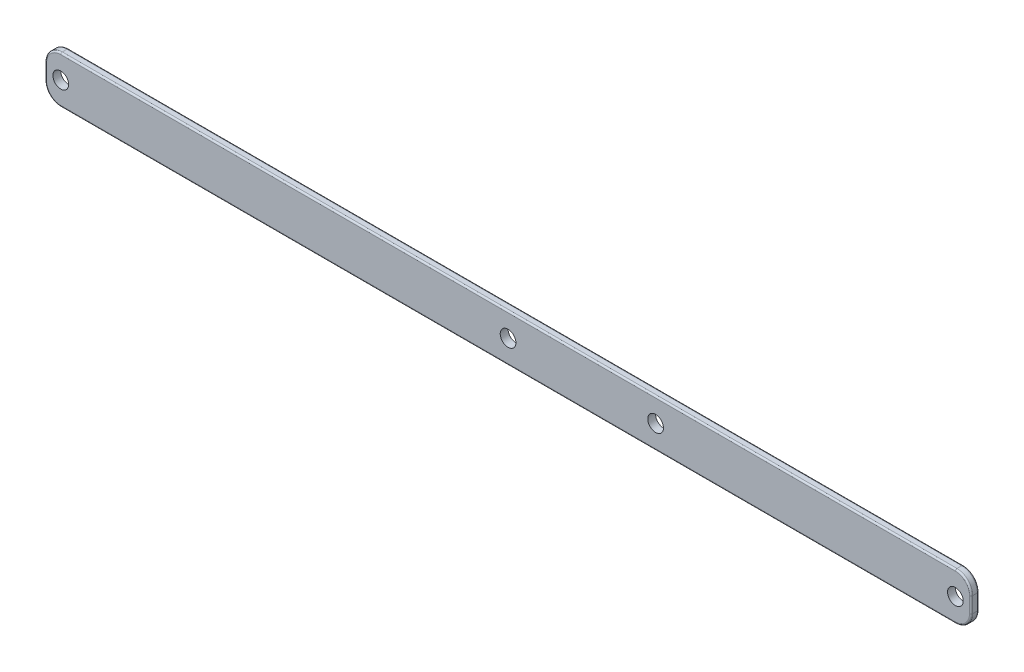
ISO-10303-21;
HEADER;
FILE_DESCRIPTION(('STEP AP214'),'2;1');
FILE_NAME('part.step','',(''),(''),'','','');
FILE_SCHEMA(('AUTOMOTIVE_DESIGN { 1 0 10303 214 1 1 1 1 }'));
ENDSEC;
DATA;
#1=APPLICATION_CONTEXT('core data for automotive mechanical design processes');
#2=APPLICATION_PROTOCOL_DEFINITION('international standard','automotive_design',2000,#1);
#3=PRODUCT_CONTEXT('',#1,'mechanical');
#4=PRODUCT('Part','Part','',(#3));
#5=PRODUCT_RELATED_PRODUCT_CATEGORY('part','',(#4));
#6=PRODUCT_DEFINITION_FORMATION('','',#4);
#7=PRODUCT_DEFINITION_CONTEXT('part definition',#1,'design');
#8=PRODUCT_DEFINITION('design','',#6,#7);
#9=PRODUCT_DEFINITION_SHAPE('','',#8);
#10=(LENGTH_UNIT() NAMED_UNIT(*) SI_UNIT(.MILLI.,.METRE.));
#11=(NAMED_UNIT(*) PLANE_ANGLE_UNIT() SI_UNIT($,.RADIAN.));
#12=(NAMED_UNIT(*) SI_UNIT($,.STERADIAN.) SOLID_ANGLE_UNIT());
#13=UNCERTAINTY_MEASURE_WITH_UNIT(LENGTH_MEASURE(1.E-05),#10,'distance_accuracy_value','');
#14=(GEOMETRIC_REPRESENTATION_CONTEXT(3) GLOBAL_UNCERTAINTY_ASSIGNED_CONTEXT((#13)) GLOBAL_UNIT_ASSIGNED_CONTEXT((#10,
#11,#12)) REPRESENTATION_CONTEXT('',''));
#15=CARTESIAN_POINT('',(0.,0.,0.));
#16=DIRECTION('',(0.,0.,1.));
#17=DIRECTION('',(1.,0.,0.));
#18=AXIS2_PLACEMENT_3D('',#15,#16,#17);
#19=CARTESIAN_POINT('',(0.,0.,5.));
#20=DIRECTION('',(0.,0.,1.));
#21=DIRECTION('',(1.,0.,0.));
#22=AXIS2_PLACEMENT_3D('',#19,#20,#21);
#23=PLANE('',#22);
#24=CARTESIAN_POINT('',(99.6776042775058,40.1673228346457,5.));
#25=DIRECTION('',(0.,0.,1.));
#26=DIRECTION('',(1.,0.,0.));
#27=AXIS2_PLACEMENT_3D('',#24,#25,#26);
#28=CIRCLE('',#27,5.00000000000001);
#29=CARTESIAN_POINT('',(104.677604277506,40.1673228346457,5.));
#30=VERTEX_POINT('',#29);
#31=EDGE_CURVE('E365',#30,#30,#28,.T.);
#32=ORIENTED_EDGE('',*,*,#31,.F.);
#33=EDGE_LOOP('',(#32));
#34=FACE_BOUND('',#33,.T.);
#35=DIRECTION('',(0.,-1.,0.));
#36=VECTOR('',#35,1.);
#37=CARTESIAN_POINT('',(-288.322395722494,35.1673228346457,5.));
#38=LINE('',#37,#36);
#39=CARTESIAN_POINT('',(-288.322395722494,45.1673228346457,5.));
#40=VERTEX_POINT('',#39);
#41=CARTESIAN_POINT('',(-288.322395722494,35.1673228346457,5.));
#42=VERTEX_POINT('',#41);
#43=EDGE_CURVE('E173',#40,#42,#38,.T.);
#44=ORIENTED_EDGE('',*,*,#43,.T.);
#45=CARTESIAN_POINT('',(-279.322395722494,35.1673228346457,5.));
#46=DIRECTION('',(0.,0.,1.));
#47=DIRECTION('',(1.,0.,0.));
#48=AXIS2_PLACEMENT_3D('',#45,#46,#47);
#49=CIRCLE('',#48,9.);
#50=CARTESIAN_POINT('',(-279.322395722494,26.1673228346457,5.));
#51=VERTEX_POINT('',#50);
#52=EDGE_CURVE('E154',#42,#51,#49,.T.);
#53=ORIENTED_EDGE('',*,*,#52,.T.);
#54=DIRECTION('',(1.,0.,0.));
#55=VECTOR('',#54,1.);
#56=CARTESIAN_POINT('',(290.677604277506,26.1673228346457,5.));
#57=LINE('',#56,#55);
#58=CARTESIAN_POINT('',(290.677604277506,26.1673228346457,5.));
#59=VERTEX_POINT('',#58);
#60=EDGE_CURVE('E162',#51,#59,#57,.T.);
#61=ORIENTED_EDGE('',*,*,#60,.T.);
#62=CARTESIAN_POINT('',(290.677604277506,35.1673228346457,5.));
#63=DIRECTION('',(0.,0.,1.));
#64=DIRECTION('',(1.,0.,0.));
#65=AXIS2_PLACEMENT_3D('',#62,#63,#64);
#66=CIRCLE('',#65,9.);
#67=CARTESIAN_POINT('',(299.677604277506,35.1673228346457,5.));
#68=VERTEX_POINT('',#67);
#69=EDGE_CURVE('E168',#59,#68,#66,.T.);
#70=ORIENTED_EDGE('',*,*,#69,.T.);
#71=DIRECTION('',(0.,1.,0.));
#72=VECTOR('',#71,1.);
#73=CARTESIAN_POINT('',(299.677604277506,45.1673228346457,5.));
#74=LINE('',#73,#72);
#75=CARTESIAN_POINT('',(299.677604277506,45.1673228346457,5.));
#76=VERTEX_POINT('',#75);
#77=EDGE_CURVE('E299',#68,#76,#74,.T.);
#78=ORIENTED_EDGE('',*,*,#77,.T.);
#79=CARTESIAN_POINT('',(290.677604277506,45.1673228346457,5.));
#80=DIRECTION('',(0.,0.,1.));
#81=DIRECTION('',(1.,0.,0.));
#82=AXIS2_PLACEMENT_3D('',#79,#80,#81);
#83=CIRCLE('',#82,9.);
#84=CARTESIAN_POINT('',(290.677604277506,54.1673228346457,5.));
#85=VERTEX_POINT('',#84);
#86=EDGE_CURVE('E301',#76,#85,#83,.T.);
#87=ORIENTED_EDGE('',*,*,#86,.T.);
#88=DIRECTION('',(-1.,0.,0.));
#89=VECTOR('',#88,1.);
#90=CARTESIAN_POINT('',(-279.322395722494,54.1673228346457,5.));
#91=LINE('',#90,#89);
#92=CARTESIAN_POINT('',(-279.322395722494,54.1673228346457,5.));
#93=VERTEX_POINT('',#92);
#94=EDGE_CURVE('E303',#85,#93,#91,.T.);
#95=ORIENTED_EDGE('',*,*,#94,.T.);
#96=CARTESIAN_POINT('',(-279.322395722494,45.1673228346457,5.));
#97=DIRECTION('',(0.,0.,1.));
#98=DIRECTION('',(1.,0.,0.));
#99=AXIS2_PLACEMENT_3D('',#96,#97,#98);
#100=CIRCLE('',#99,9.);
#101=EDGE_CURVE('E179',#93,#40,#100,.T.);
#102=ORIENTED_EDGE('',*,*,#101,.T.);
#103=EDGE_LOOP('',(#44,#53,#61,#70,#78,#87,#95,#102));
#104=FACE_BOUND('',#103,.T.);
#105=CARTESIAN_POINT('',(290.677604277506,40.1673228346457,5.));
#106=DIRECTION('',(0.,0.,1.));
#107=DIRECTION('',(1.,0.,0.));
#108=AXIS2_PLACEMENT_3D('',#105,#106,#107);
#109=CIRCLE('',#108,4.99999999999999);
#110=CARTESIAN_POINT('',(295.677604277506,40.1673228346457,5.));
#111=VERTEX_POINT('',#110);
#112=EDGE_CURVE('E350',#111,#111,#109,.T.);
#113=ORIENTED_EDGE('',*,*,#112,.F.);
#114=EDGE_LOOP('',(#113));
#115=FACE_BOUND('',#114,.T.);
#116=CARTESIAN_POINT('',(-279.322395722494,40.1673228346457,5.));
#117=DIRECTION('',(0.,0.,1.));
#118=DIRECTION('',(1.,0.,0.));
#119=AXIS2_PLACEMENT_3D('',#116,#117,#118);
#120=CIRCLE('',#119,4.99999999999999);
#121=CARTESIAN_POINT('',(-274.322395722494,40.1673228346457,5.));
#122=VERTEX_POINT('',#121);
#123=EDGE_CURVE('E346',#122,#122,#120,.T.);
#124=ORIENTED_EDGE('',*,*,#123,.F.);
#125=EDGE_LOOP('',(#124));
#126=FACE_BOUND('',#125,.T.);
#127=CARTESIAN_POINT('',(5.67760427750585,40.1673228346457,5.));
#128=DIRECTION('',(0.,0.,1.));
#129=DIRECTION('',(1.,0.,0.));
#130=AXIS2_PLACEMENT_3D('',#127,#128,#129);
#131=CIRCLE('',#130,5.);
#132=CARTESIAN_POINT('',(10.6776042775059,40.1673228346457,5.));
#133=VERTEX_POINT('',#132);
#134=EDGE_CURVE('E356',#133,#133,#131,.T.);
#135=ORIENTED_EDGE('',*,*,#134,.F.);
#136=EDGE_LOOP('',(#135));
#137=FACE_BOUND('',#136,.T.);
#138=ADVANCED_FACE('F33',(#34,#104,#115,#126,#137),#23,.T.);
#139=CARTESIAN_POINT('',(0.,0.,0.));
#140=DIRECTION('',(0.,0.,1.));
#141=DIRECTION('',(1.,0.,0.));
#142=AXIS2_PLACEMENT_3D('',#139,#140,#141);
#143=PLANE('',#142);
#144=CARTESIAN_POINT('',(99.6776042775058,40.1673228346457,0.));
#145=DIRECTION('',(0.,0.,1.));
#146=DIRECTION('',(1.,0.,0.));
#147=AXIS2_PLACEMENT_3D('',#144,#145,#146);
#148=CIRCLE('',#147,5.00000000000001);
#149=CARTESIAN_POINT('',(104.677604277506,40.1673228346457,0.));
#150=VERTEX_POINT('',#149);
#151=EDGE_CURVE('E244',#150,#150,#148,.F.);
#152=ORIENTED_EDGE('',*,*,#151,.F.);
#153=EDGE_LOOP('',(#152));
#154=FACE_BOUND('',#153,.T.);
#155=DIRECTION('',(1.,0.,0.));
#156=VECTOR('',#155,1.);
#157=CARTESIAN_POINT('',(0.,26.1673228346457,0.));
#158=LINE('',#157,#156);
#159=CARTESIAN_POINT('',(290.677604277506,26.1673228346457,0.));
#160=VERTEX_POINT('',#159);
#161=CARTESIAN_POINT('',(-279.322395722494,26.1673228346457,0.));
#162=VERTEX_POINT('',#161);
#163=EDGE_CURVE('E208',#160,#162,#158,.F.);
#164=ORIENTED_EDGE('',*,*,#163,.T.);
#165=CARTESIAN_POINT('',(-279.322395722494,35.1673228346457,0.));
#166=DIRECTION('',(0.,0.,1.));
#167=DIRECTION('',(1.,0.,0.));
#168=AXIS2_PLACEMENT_3D('',#165,#166,#167);
#169=CIRCLE('',#168,9.);
#170=CARTESIAN_POINT('',(-288.322395722494,35.1673228346457,0.));
#171=VERTEX_POINT('',#170);
#172=EDGE_CURVE('E221',#162,#171,#169,.F.);
#173=ORIENTED_EDGE('',*,*,#172,.T.);
#174=DIRECTION('',(0.,-1.,0.));
#175=VECTOR('',#174,1.);
#176=CARTESIAN_POINT('',(-288.322395722494,5.33503603743665E-13,0.));
#177=LINE('',#176,#175);
#178=CARTESIAN_POINT('',(-288.322395722494,45.1673228346457,0.));
#179=VERTEX_POINT('',#178);
#180=EDGE_CURVE('E57',#171,#179,#177,.F.);
#181=ORIENTED_EDGE('',*,*,#180,.T.);
#182=CARTESIAN_POINT('',(-279.322395722494,45.1673228346457,0.));
#183=DIRECTION('',(0.,0.,1.));
#184=DIRECTION('',(1.,0.,0.));
#185=AXIS2_PLACEMENT_3D('',#182,#183,#184);
#186=CIRCLE('',#185,9.);
#187=CARTESIAN_POINT('',(-279.322395722494,54.1673228346457,0.));
#188=VERTEX_POINT('',#187);
#189=EDGE_CURVE('E218',#179,#188,#186,.F.);
#190=ORIENTED_EDGE('',*,*,#189,.T.);
#191=DIRECTION('',(-1.,0.,0.));
#192=VECTOR('',#191,1.);
#193=CARTESIAN_POINT('',(0.,54.1673228346457,0.));
#194=LINE('',#193,#192);
#195=CARTESIAN_POINT('',(290.677604277506,54.1673228346457,0.));
#196=VERTEX_POINT('',#195);
#197=EDGE_CURVE('E216',#188,#196,#194,.F.);
#198=ORIENTED_EDGE('',*,*,#197,.T.);
#199=CARTESIAN_POINT('',(290.677604277506,45.1673228346457,0.));
#200=DIRECTION('',(0.,0.,1.));
#201=DIRECTION('',(1.,0.,0.));
#202=AXIS2_PLACEMENT_3D('',#199,#200,#201);
#203=CIRCLE('',#202,9.);
#204=CARTESIAN_POINT('',(299.677604277506,45.1673228346457,0.));
#205=VERTEX_POINT('',#204);
#206=EDGE_CURVE('E214',#196,#205,#203,.F.);
#207=ORIENTED_EDGE('',*,*,#206,.T.);
#208=DIRECTION('',(0.,1.,0.));
#209=VECTOR('',#208,1.);
#210=CARTESIAN_POINT('',(299.677604277506,0.,0.));
#211=LINE('',#210,#209);
#212=CARTESIAN_POINT('',(299.677604277506,35.1673228346457,0.));
#213=VERTEX_POINT('',#212);
#214=EDGE_CURVE('E212',#205,#213,#211,.F.);
#215=ORIENTED_EDGE('',*,*,#214,.T.);
#216=CARTESIAN_POINT('',(290.677604277506,35.1673228346457,0.));
#217=DIRECTION('',(0.,0.,1.));
#218=DIRECTION('',(1.,0.,0.));
#219=AXIS2_PLACEMENT_3D('',#216,#217,#218);
#220=CIRCLE('',#219,9.);
#221=EDGE_CURVE('E210',#213,#160,#220,.F.);
#222=ORIENTED_EDGE('',*,*,#221,.T.);
#223=EDGE_LOOP('',(#164,#173,#181,#190,#198,#207,#215,#222));
#224=FACE_BOUND('',#223,.T.);
#225=CARTESIAN_POINT('',(-279.322395722494,40.1673228346457,0.));
#226=DIRECTION('',(0.,0.,1.));
#227=DIRECTION('',(1.,0.,0.));
#228=AXIS2_PLACEMENT_3D('',#225,#226,#227);
#229=CIRCLE('',#228,4.99999999999999);
#230=CARTESIAN_POINT('',(-274.322395722494,40.1673228346457,0.));
#231=VERTEX_POINT('',#230);
#232=EDGE_CURVE('E347',#231,#231,#229,.T.);
#233=ORIENTED_EDGE('',*,*,#232,.T.);
#234=EDGE_LOOP('',(#233));
#235=FACE_BOUND('',#234,.T.);
#236=CARTESIAN_POINT('',(290.677604277506,40.1673228346457,0.));
#237=DIRECTION('',(0.,0.,1.));
#238=DIRECTION('',(1.,0.,0.));
#239=AXIS2_PLACEMENT_3D('',#236,#237,#238);
#240=CIRCLE('',#239,4.99999999999999);
#241=CARTESIAN_POINT('',(295.677604277506,40.1673228346457,0.));
#242=VERTEX_POINT('',#241);
#243=EDGE_CURVE('E353',#242,#242,#240,.T.);
#244=ORIENTED_EDGE('',*,*,#243,.T.);
#245=EDGE_LOOP('',(#244));
#246=FACE_BOUND('',#245,.T.);
#247=CARTESIAN_POINT('',(5.67760427750585,40.1673228346457,0.));
#248=DIRECTION('',(0.,0.,1.));
#249=DIRECTION('',(1.,0.,0.));
#250=AXIS2_PLACEMENT_3D('',#247,#248,#249);
#251=CIRCLE('',#250,5.);
#252=CARTESIAN_POINT('',(10.6776042775059,40.1673228346457,0.));
#253=VERTEX_POINT('',#252);
#254=EDGE_CURVE('E241',#253,#253,#251,.T.);
#255=ORIENTED_EDGE('',*,*,#254,.T.);
#256=EDGE_LOOP('',(#255));
#257=FACE_BOUND('',#256,.T.);
#258=ADVANCED_FACE('F327',(#154,#224,#235,#246,#257),#143,.F.);
#259=CARTESIAN_POINT('',(-289.322395722494,55.1673228346457,5.));
#260=DIRECTION('',(1.,0.,0.));
#261=DIRECTION('',(0.,1.,0.));
#262=AXIS2_PLACEMENT_3D('',#259,#260,#261);
#263=PLANE('',#262);
#264=DIRECTION('',(0.,0.,-1.));
#265=VECTOR('',#264,1.);
#266=CARTESIAN_POINT('',(-289.322395722494,35.1673228346457,5.));
#267=LINE('',#266,#265);
#268=CARTESIAN_POINT('',(-289.322395722494,35.1673228346457,1.));
#269=VERTEX_POINT('',#268);
#270=CARTESIAN_POINT('',(-289.322395722494,35.1673228346457,4.));
#271=VERTEX_POINT('',#270);
#272=EDGE_CURVE('E169',#269,#271,#267,.F.);
#273=ORIENTED_EDGE('',*,*,#272,.T.);
#274=DIRECTION('',(0.,-1.,0.));
#275=VECTOR('',#274,1.);
#276=CARTESIAN_POINT('',(-289.322395722494,45.1673228346457,4.));
#277=LINE('',#276,#275);
#278=CARTESIAN_POINT('',(-289.322395722494,45.1673228346457,4.));
#279=VERTEX_POINT('',#278);
#280=EDGE_CURVE('E186',#271,#279,#277,.F.);
#281=ORIENTED_EDGE('',*,*,#280,.T.);
#282=DIRECTION('',(0.,0.,-1.));
#283=VECTOR('',#282,1.);
#284=CARTESIAN_POINT('',(-289.322395722494,45.1673228346457,5.));
#285=LINE('',#284,#283);
#286=CARTESIAN_POINT('',(-289.322395722494,45.1673228346457,1.));
#287=VERTEX_POINT('',#286);
#288=EDGE_CURVE('E287',#279,#287,#285,.T.);
#289=ORIENTED_EDGE('',*,*,#288,.T.);
#290=DIRECTION('',(0.,-1.,0.));
#291=VECTOR('',#290,1.);
#292=CARTESIAN_POINT('',(-289.322395722494,55.1673228346457,1.));
#293=LINE('',#292,#291);
#294=EDGE_CURVE('E184',#287,#269,#293,.T.);
#295=ORIENTED_EDGE('',*,*,#294,.T.);
#296=EDGE_LOOP('',(#273,#281,#289,#295));
#297=FACE_BOUND('',#296,.T.);
#298=ADVANCED_FACE('F322',(#297),#263,.F.);
#299=CARTESIAN_POINT('',(-289.322395722494,25.1673228346457,5.));
#300=DIRECTION('',(0.,1.,0.));
#301=DIRECTION('',(0.,0.,1.));
#302=AXIS2_PLACEMENT_3D('',#299,#300,#301);
#303=PLANE('',#302);
#304=DIRECTION('',(0.,0.,-1.));
#305=VECTOR('',#304,1.);
#306=CARTESIAN_POINT('',(290.677604277506,25.1673228346457,5.));
#307=LINE('',#306,#305);
#308=CARTESIAN_POINT('',(290.677604277506,25.1673228346457,1.));
#309=VERTEX_POINT('',#308);
#310=CARTESIAN_POINT('',(290.677604277506,25.1673228346457,4.));
#311=VERTEX_POINT('',#310);
#312=EDGE_CURVE('E292',#309,#311,#307,.F.);
#313=ORIENTED_EDGE('',*,*,#312,.T.);
#314=DIRECTION('',(1.,0.,0.));
#315=VECTOR('',#314,1.);
#316=CARTESIAN_POINT('',(-279.322395722494,25.1673228346457,4.));
#317=LINE('',#316,#315);
#318=CARTESIAN_POINT('',(-279.322395722494,25.1673228346457,4.));
#319=VERTEX_POINT('',#318);
#320=EDGE_CURVE('E11',#311,#319,#317,.F.);
#321=ORIENTED_EDGE('',*,*,#320,.T.);
#322=DIRECTION('',(0.,0.,-1.));
#323=VECTOR('',#322,1.);
#324=CARTESIAN_POINT('',(-279.322395722494,25.1673228346457,5.));
#325=LINE('',#324,#323);
#326=CARTESIAN_POINT('',(-279.322395722494,25.1673228346457,1.));
#327=VERTEX_POINT('',#326);
#328=EDGE_CURVE('E321',#319,#327,#325,.T.);
#329=ORIENTED_EDGE('',*,*,#328,.T.);
#330=DIRECTION('',(1.,0.,0.));
#331=VECTOR('',#330,1.);
#332=CARTESIAN_POINT('',(-289.322395722494,25.1673228346457,1.));
#333=LINE('',#332,#331);
#334=EDGE_CURVE('E42',#327,#309,#333,.T.);
#335=ORIENTED_EDGE('',*,*,#334,.T.);
#336=EDGE_LOOP('',(#313,#321,#329,#335));
#337=FACE_BOUND('',#336,.T.);
#338=ADVANCED_FACE('F339',(#337),#303,.F.);
#339=CARTESIAN_POINT('',(300.677604277506,55.1673228346457,5.));
#340=DIRECTION('',(-1.,0.,0.));
#341=DIRECTION('',(0.,0.,1.));
#342=AXIS2_PLACEMENT_3D('',#339,#340,#341);
#343=PLANE('',#342);
#344=DIRECTION('',(0.,0.,-1.));
#345=VECTOR('',#344,1.);
#346=CARTESIAN_POINT('',(300.677604277506,45.1673228346457,5.));
#347=LINE('',#346,#345);
#348=CARTESIAN_POINT('',(300.677604277506,45.1673228346457,1.));
#349=VERTEX_POINT('',#348);
#350=CARTESIAN_POINT('',(300.677604277506,45.1673228346457,4.));
#351=VERTEX_POINT('',#350);
#352=EDGE_CURVE('E281',#349,#351,#347,.F.);
#353=ORIENTED_EDGE('',*,*,#352,.T.);
#354=DIRECTION('',(0.,1.,0.));
#355=VECTOR('',#354,1.);
#356=CARTESIAN_POINT('',(300.677604277506,35.1673228346457,4.));
#357=LINE('',#356,#355);
#358=CARTESIAN_POINT('',(300.677604277506,35.1673228346457,4.));
#359=VERTEX_POINT('',#358);
#360=EDGE_CURVE('E202',#351,#359,#357,.F.);
#361=ORIENTED_EDGE('',*,*,#360,.T.);
#362=DIRECTION('',(0.,0.,-1.));
#363=VECTOR('',#362,1.);
#364=CARTESIAN_POINT('',(300.677604277506,35.1673228346457,5.));
#365=LINE('',#364,#363);
#366=CARTESIAN_POINT('',(300.677604277506,35.1673228346457,1.));
#367=VERTEX_POINT('',#366);
#368=EDGE_CURVE('E340',#359,#367,#365,.T.);
#369=ORIENTED_EDGE('',*,*,#368,.T.);
#370=DIRECTION('',(0.,1.,0.));
#371=VECTOR('',#370,1.);
#372=CARTESIAN_POINT('',(300.677604277506,55.1673228346457,1.));
#373=LINE('',#372,#371);
#374=EDGE_CURVE('E200',#367,#349,#373,.T.);
#375=ORIENTED_EDGE('',*,*,#374,.T.);
#376=EDGE_LOOP('',(#353,#361,#369,#375));
#377=FACE_BOUND('',#376,.T.);
#378=ADVANCED_FACE('F385',(#377),#343,.F.);
#379=CARTESIAN_POINT('',(-289.322395722494,55.1673228346457,5.));
#380=DIRECTION('',(0.,-1.,0.));
#381=DIRECTION('',(0.,0.,-1.));
#382=AXIS2_PLACEMENT_3D('',#379,#380,#381);
#383=PLANE('',#382);
#384=DIRECTION('',(0.,0.,-1.));
#385=VECTOR('',#384,1.);
#386=CARTESIAN_POINT('',(-279.322395722494,55.1673228346457,5.));
#387=LINE('',#386,#385);
#388=CARTESIAN_POINT('',(-279.322395722494,55.1673228346457,1.));
#389=VERTEX_POINT('',#388);
#390=CARTESIAN_POINT('',(-279.322395722494,55.1673228346457,4.));
#391=VERTEX_POINT('',#390);
#392=EDGE_CURVE('E288',#389,#391,#387,.F.);
#393=ORIENTED_EDGE('',*,*,#392,.T.);
#394=DIRECTION('',(-1.,0.,0.));
#395=VECTOR('',#394,1.);
#396=CARTESIAN_POINT('',(290.677604277506,55.1673228346457,4.));
#397=LINE('',#396,#395);
#398=CARTESIAN_POINT('',(290.677604277506,55.1673228346457,4.));
#399=VERTEX_POINT('',#398);
#400=EDGE_CURVE('E194',#391,#399,#397,.F.);
#401=ORIENTED_EDGE('',*,*,#400,.T.);
#402=DIRECTION('',(0.,0.,-1.));
#403=VECTOR('',#402,1.);
#404=CARTESIAN_POINT('',(290.677604277506,55.1673228346457,5.));
#405=LINE('',#404,#403);
#406=CARTESIAN_POINT('',(290.677604277506,55.1673228346457,1.));
#407=VERTEX_POINT('',#406);
#408=EDGE_CURVE('E278',#399,#407,#405,.T.);
#409=ORIENTED_EDGE('',*,*,#408,.T.);
#410=DIRECTION('',(-1.,0.,0.));
#411=VECTOR('',#410,1.);
#412=CARTESIAN_POINT('',(-289.322395722494,55.1673228346457,1.));
#413=LINE('',#412,#411);
#414=EDGE_CURVE('E192',#407,#389,#413,.T.);
#415=ORIENTED_EDGE('',*,*,#414,.T.);
#416=EDGE_LOOP('',(#393,#401,#409,#415));
#417=FACE_BOUND('',#416,.T.);
#418=ADVANCED_FACE('F284',(#417),#383,.F.);
#419=CARTESIAN_POINT('',(-279.322395722494,40.1673228346457,5.));
#420=DIRECTION('',(0.,0.,-1.));
#421=DIRECTION('',(-1.,0.,0.));
#422=AXIS2_PLACEMENT_3D('',#419,#420,#421);
#423=CYLINDRICAL_SURFACE('',#422,4.99999999999999);
#424=ORIENTED_EDGE('',*,*,#123,.T.);
#425=EDGE_LOOP('',(#424));
#426=FACE_BOUND('',#425,.T.);
#427=ORIENTED_EDGE('',*,*,#232,.F.);
#428=EDGE_LOOP('',(#427));
#429=FACE_BOUND('',#428,.T.);
#430=ADVANCED_FACE('F380',(#426,#429),#423,.F.);
#431=CARTESIAN_POINT('',(290.677604277506,40.1673228346457,5.));
#432=DIRECTION('',(0.,0.,-1.));
#433=DIRECTION('',(-1.,0.,0.));
#434=AXIS2_PLACEMENT_3D('',#431,#432,#433);
#435=CYLINDRICAL_SURFACE('',#434,4.99999999999999);
#436=ORIENTED_EDGE('',*,*,#112,.T.);
#437=EDGE_LOOP('',(#436));
#438=FACE_BOUND('',#437,.T.);
#439=ORIENTED_EDGE('',*,*,#243,.F.);
#440=EDGE_LOOP('',(#439));
#441=FACE_BOUND('',#440,.T.);
#442=ADVANCED_FACE('F507',(#438,#441),#435,.F.);
#443=CARTESIAN_POINT('',(5.67760427750585,40.1673228346457,5.));
#444=DIRECTION('',(0.,0.,-1.));
#445=DIRECTION('',(-1.,0.,0.));
#446=AXIS2_PLACEMENT_3D('',#443,#444,#445);
#447=CYLINDRICAL_SURFACE('',#446,5.);
#448=ORIENTED_EDGE('',*,*,#134,.T.);
#449=EDGE_LOOP('',(#448));
#450=FACE_BOUND('',#449,.T.);
#451=ORIENTED_EDGE('',*,*,#254,.F.);
#452=EDGE_LOOP('',(#451));
#453=FACE_BOUND('',#452,.T.);
#454=ADVANCED_FACE('F396',(#450,#453),#447,.F.);
#455=CARTESIAN_POINT('',(290.677604277506,35.1673228346457,5.));
#456=DIRECTION('',(0.,0.,-1.));
#457=DIRECTION('',(-1.,0.,0.));
#458=AXIS2_PLACEMENT_3D('',#455,#456,#457);
#459=CYLINDRICAL_SURFACE('',#458,10.);
#460=ORIENTED_EDGE('',*,*,#368,.F.);
#461=CARTESIAN_POINT('',(290.677604277506,35.1673228346457,4.));
#462=DIRECTION('',(0.,0.,1.));
#463=DIRECTION('',(1.,0.,0.));
#464=AXIS2_PLACEMENT_3D('',#461,#462,#463);
#465=CIRCLE('',#464,10.);
#466=EDGE_CURVE('E206',#359,#311,#465,.F.);
#467=ORIENTED_EDGE('',*,*,#466,.T.);
#468=ORIENTED_EDGE('',*,*,#312,.F.);
#469=CARTESIAN_POINT('',(290.677604277506,35.1673228346457,1.));
#470=DIRECTION('',(0.,0.,1.));
#471=DIRECTION('',(1.,0.,0.));
#472=AXIS2_PLACEMENT_3D('',#469,#470,#471);
#473=CIRCLE('',#472,10.);
#474=EDGE_CURVE('E204',#309,#367,#473,.T.);
#475=ORIENTED_EDGE('',*,*,#474,.T.);
#476=EDGE_LOOP('',(#460,#467,#468,#475));
#477=FACE_BOUND('',#476,.T.);
#478=ADVANCED_FACE('F393',(#477),#459,.T.);
#479=CARTESIAN_POINT('',(290.677604277506,45.1673228346457,5.));
#480=DIRECTION('',(0.,0.,-1.));
#481=DIRECTION('',(-1.,0.,0.));
#482=AXIS2_PLACEMENT_3D('',#479,#480,#481);
#483=CYLINDRICAL_SURFACE('',#482,10.);
#484=ORIENTED_EDGE('',*,*,#408,.F.);
#485=CARTESIAN_POINT('',(290.677604277506,45.1673228346457,4.));
#486=DIRECTION('',(0.,0.,1.));
#487=DIRECTION('',(1.,0.,0.));
#488=AXIS2_PLACEMENT_3D('',#485,#486,#487);
#489=CIRCLE('',#488,10.);
#490=EDGE_CURVE('E198',#399,#351,#489,.F.);
#491=ORIENTED_EDGE('',*,*,#490,.T.);
#492=ORIENTED_EDGE('',*,*,#352,.F.);
#493=CARTESIAN_POINT('',(290.677604277506,45.1673228346457,1.));
#494=DIRECTION('',(0.,0.,1.));
#495=DIRECTION('',(1.,0.,0.));
#496=AXIS2_PLACEMENT_3D('',#493,#494,#495);
#497=CIRCLE('',#496,10.);
#498=EDGE_CURVE('E196',#349,#407,#497,.T.);
#499=ORIENTED_EDGE('',*,*,#498,.T.);
#500=EDGE_LOOP('',(#484,#491,#492,#499));
#501=FACE_BOUND('',#500,.T.);
#502=ADVANCED_FACE('F277',(#501),#483,.T.);
#503=CARTESIAN_POINT('',(-279.322395722494,35.1673228346457,5.));
#504=DIRECTION('',(0.,0.,-1.));
#505=DIRECTION('',(-1.,0.,0.));
#506=AXIS2_PLACEMENT_3D('',#503,#504,#505);
#507=CYLINDRICAL_SURFACE('',#506,10.);
#508=ORIENTED_EDGE('',*,*,#328,.F.);
#509=CARTESIAN_POINT('',(-279.322395722494,35.1673228346457,4.));
#510=DIRECTION('',(0.,0.,1.));
#511=DIRECTION('',(1.,0.,0.));
#512=AXIS2_PLACEMENT_3D('',#509,#510,#511);
#513=CIRCLE('',#512,10.);
#514=EDGE_CURVE('E156',#319,#271,#513,.F.);
#515=ORIENTED_EDGE('',*,*,#514,.T.);
#516=ORIENTED_EDGE('',*,*,#272,.F.);
#517=CARTESIAN_POINT('',(-279.322395722494,35.1673228346457,1.));
#518=DIRECTION('',(0.,0.,1.));
#519=DIRECTION('',(1.,0.,0.));
#520=AXIS2_PLACEMENT_3D('',#517,#518,#519);
#521=CIRCLE('',#520,10.);
#522=EDGE_CURVE('E175',#269,#327,#521,.T.);
#523=ORIENTED_EDGE('',*,*,#522,.T.);
#524=EDGE_LOOP('',(#508,#515,#516,#523));
#525=FACE_BOUND('',#524,.T.);
#526=ADVANCED_FACE('F319',(#525),#507,.T.);
#527=CARTESIAN_POINT('',(-279.322395722494,45.1673228346457,5.));
#528=DIRECTION('',(0.,0.,-1.));
#529=DIRECTION('',(-1.,0.,0.));
#530=AXIS2_PLACEMENT_3D('',#527,#528,#529);
#531=CYLINDRICAL_SURFACE('',#530,10.);
#532=ORIENTED_EDGE('',*,*,#288,.F.);
#533=CARTESIAN_POINT('',(-279.322395722494,45.1673228346457,4.));
#534=DIRECTION('',(0.,0.,1.));
#535=DIRECTION('',(1.,0.,0.));
#536=AXIS2_PLACEMENT_3D('',#533,#534,#535);
#537=CIRCLE('',#536,10.);
#538=EDGE_CURVE('E190',#279,#391,#537,.F.);
#539=ORIENTED_EDGE('',*,*,#538,.T.);
#540=ORIENTED_EDGE('',*,*,#392,.F.);
#541=CARTESIAN_POINT('',(-279.322395722494,45.1673228346457,1.));
#542=DIRECTION('',(0.,0.,1.));
#543=DIRECTION('',(1.,0.,0.));
#544=AXIS2_PLACEMENT_3D('',#541,#542,#543);
#545=CIRCLE('',#544,10.);
#546=EDGE_CURVE('E188',#389,#287,#545,.T.);
#547=ORIENTED_EDGE('',*,*,#546,.T.);
#548=EDGE_LOOP('',(#532,#539,#540,#547));
#549=FACE_BOUND('',#548,.T.);
#550=ADVANCED_FACE('F402',(#549),#531,.T.);
#551=CARTESIAN_POINT('',(290.677604277506,45.1673228346457,4.));
#552=DIRECTION('',(0.,0.,1.));
#553=DIRECTION('',(1.,0.,0.));
#554=AXIS2_PLACEMENT_3D('',#551,#552,#553);
#555=TOROIDAL_SURFACE('',#554,9.,1.);
#556=CARTESIAN_POINT('',(299.677604277506,45.1673228346457,4.));
#557=DIRECTION('',(0.,-1.,0.));
#558=DIRECTION('',(0.,0.,-1.));
#559=AXIS2_PLACEMENT_3D('',#556,#557,#558);
#560=CIRCLE('',#559,1.);
#561=EDGE_CURVE('E235',#351,#76,#560,.T.);
#562=ORIENTED_EDGE('',*,*,#561,.F.);
#563=ORIENTED_EDGE('',*,*,#490,.F.);
#564=CARTESIAN_POINT('',(290.677604277506,54.1673228346457,4.));
#565=DIRECTION('',(-1.,0.,0.));
#566=DIRECTION('',(0.,0.,1.));
#567=AXIS2_PLACEMENT_3D('',#564,#565,#566);
#568=CIRCLE('',#567,1.);
#569=EDGE_CURVE('E238',#85,#399,#568,.T.);
#570=ORIENTED_EDGE('',*,*,#569,.F.);
#571=ORIENTED_EDGE('',*,*,#86,.F.);
#572=EDGE_LOOP('',(#562,#563,#570,#571));
#573=FACE_BOUND('',#572,.T.);
#574=ADVANCED_FACE('F405',(#573),#555,.T.);
#575=CARTESIAN_POINT('',(0.,54.1673228346457,4.));
#576=DIRECTION('',(1.,0.,0.));
#577=DIRECTION('',(0.,0.,-1.));
#578=AXIS2_PLACEMENT_3D('',#575,#576,#577);
#579=CYLINDRICAL_SURFACE('',#578,1.);
#580=ORIENTED_EDGE('',*,*,#569,.T.);
#581=ORIENTED_EDGE('',*,*,#400,.F.);
#582=CARTESIAN_POINT('',(-279.322395722494,54.1673228346457,4.));
#583=DIRECTION('',(-1.,0.,0.));
#584=DIRECTION('',(0.,0.,1.));
#585=AXIS2_PLACEMENT_3D('',#582,#583,#584);
#586=CIRCLE('',#585,1.);
#587=EDGE_CURVE('E232',#93,#391,#586,.T.);
#588=ORIENTED_EDGE('',*,*,#587,.F.);
#589=ORIENTED_EDGE('',*,*,#94,.F.);
#590=EDGE_LOOP('',(#580,#581,#588,#589));
#591=FACE_BOUND('',#590,.T.);
#592=ADVANCED_FACE('F422',(#591),#579,.T.);
#593=CARTESIAN_POINT('',(299.677604277506,0.,4.));
#594=DIRECTION('',(0.,-1.,0.));
#595=DIRECTION('',(0.,0.,-1.));
#596=AXIS2_PLACEMENT_3D('',#593,#594,#595);
#597=CYLINDRICAL_SURFACE('',#596,1.);
#598=ORIENTED_EDGE('',*,*,#561,.T.);
#599=ORIENTED_EDGE('',*,*,#77,.F.);
#600=CARTESIAN_POINT('',(299.677604277506,35.1673228346457,4.));
#601=DIRECTION('',(0.,-1.,0.));
#602=DIRECTION('',(0.,0.,-1.));
#603=AXIS2_PLACEMENT_3D('',#600,#601,#602);
#604=CIRCLE('',#603,1.);
#605=EDGE_CURVE('E229',#359,#68,#604,.T.);
#606=ORIENTED_EDGE('',*,*,#605,.F.);
#607=ORIENTED_EDGE('',*,*,#360,.F.);
#608=EDGE_LOOP('',(#598,#599,#606,#607));
#609=FACE_BOUND('',#608,.T.);
#610=ADVANCED_FACE('F419',(#609),#597,.T.);
#611=CARTESIAN_POINT('',(-279.322395722494,45.1673228346457,4.));
#612=DIRECTION('',(0.,0.,1.));
#613=DIRECTION('',(1.,0.,0.));
#614=AXIS2_PLACEMENT_3D('',#611,#612,#613);
#615=TOROIDAL_SURFACE('',#614,9.,1.);
#616=ORIENTED_EDGE('',*,*,#587,.T.);
#617=ORIENTED_EDGE('',*,*,#538,.F.);
#618=CARTESIAN_POINT('',(-288.322395722494,45.1673228346457,4.));
#619=DIRECTION('',(0.,-1.,0.));
#620=DIRECTION('',(0.,0.,-1.));
#621=AXIS2_PLACEMENT_3D('',#618,#619,#620);
#622=CIRCLE('',#621,1.);
#623=EDGE_CURVE('E226',#40,#279,#622,.T.);
#624=ORIENTED_EDGE('',*,*,#623,.F.);
#625=ORIENTED_EDGE('',*,*,#101,.F.);
#626=EDGE_LOOP('',(#616,#617,#624,#625));
#627=FACE_BOUND('',#626,.T.);
#628=ADVANCED_FACE('F310',(#627),#615,.T.);
#629=CARTESIAN_POINT('',(290.677604277506,35.1673228346457,4.));
#630=DIRECTION('',(0.,0.,1.));
#631=DIRECTION('',(1.,0.,0.));
#632=AXIS2_PLACEMENT_3D('',#629,#630,#631);
#633=TOROIDAL_SURFACE('',#632,9.,1.);
#634=ORIENTED_EDGE('',*,*,#605,.T.);
#635=ORIENTED_EDGE('',*,*,#69,.F.);
#636=CARTESIAN_POINT('',(290.677604277506,26.1673228346457,4.));
#637=DIRECTION('',(-1.,0.,0.));
#638=DIRECTION('',(0.,0.,1.));
#639=AXIS2_PLACEMENT_3D('',#636,#637,#638);
#640=CIRCLE('',#639,1.);
#641=EDGE_CURVE('E165',#311,#59,#640,.T.);
#642=ORIENTED_EDGE('',*,*,#641,.F.);
#643=ORIENTED_EDGE('',*,*,#466,.F.);
#644=EDGE_LOOP('',(#634,#635,#642,#643));
#645=FACE_BOUND('',#644,.T.);
#646=ADVANCED_FACE('F413',(#645),#633,.T.);
#647=CARTESIAN_POINT('',(-288.322395722494,5.33503603743665E-13,4.));
#648=DIRECTION('',(0.,1.,0.));
#649=DIRECTION('',(-1.,0.,0.));
#650=AXIS2_PLACEMENT_3D('',#647,#648,#649);
#651=CYLINDRICAL_SURFACE('',#650,1.);
#652=ORIENTED_EDGE('',*,*,#623,.T.);
#653=ORIENTED_EDGE('',*,*,#280,.F.);
#654=CARTESIAN_POINT('',(-288.322395722494,35.1673228346457,4.));
#655=DIRECTION('',(0.,-1.,0.));
#656=DIRECTION('',(0.,0.,-1.));
#657=AXIS2_PLACEMENT_3D('',#654,#655,#656);
#658=CIRCLE('',#657,1.);
#659=EDGE_CURVE('E159',#42,#271,#658,.T.);
#660=ORIENTED_EDGE('',*,*,#659,.F.);
#661=ORIENTED_EDGE('',*,*,#43,.F.);
#662=EDGE_LOOP('',(#652,#653,#660,#661));
#663=FACE_BOUND('',#662,.T.);
#664=ADVANCED_FACE('F313',(#663),#651,.T.);
#665=CARTESIAN_POINT('',(0.,26.1673228346457,4.));
#666=DIRECTION('',(-1.,0.,0.));
#667=DIRECTION('',(0.,0.,1.));
#668=AXIS2_PLACEMENT_3D('',#665,#666,#667);
#669=CYLINDRICAL_SURFACE('',#668,1.);
#670=ORIENTED_EDGE('',*,*,#641,.T.);
#671=ORIENTED_EDGE('',*,*,#60,.F.);
#672=CARTESIAN_POINT('',(-279.322395722494,26.1673228346457,4.));
#673=DIRECTION('',(-1.,0.,0.));
#674=DIRECTION('',(0.,0.,1.));
#675=AXIS2_PLACEMENT_3D('',#672,#673,#674);
#676=CIRCLE('',#675,1.);
#677=EDGE_CURVE('E150',#319,#51,#676,.T.);
#678=ORIENTED_EDGE('',*,*,#677,.F.);
#679=ORIENTED_EDGE('',*,*,#320,.F.);
#680=EDGE_LOOP('',(#670,#671,#678,#679));
#681=FACE_BOUND('',#680,.T.);
#682=ADVANCED_FACE('F163',(#681),#669,.T.);
#683=CARTESIAN_POINT('',(-279.322395722494,35.1673228346457,4.));
#684=DIRECTION('',(0.,0.,1.));
#685=DIRECTION('',(1.,0.,0.));
#686=AXIS2_PLACEMENT_3D('',#683,#684,#685);
#687=TOROIDAL_SURFACE('',#686,9.,1.);
#688=ORIENTED_EDGE('',*,*,#659,.T.);
#689=ORIENTED_EDGE('',*,*,#514,.F.);
#690=ORIENTED_EDGE('',*,*,#677,.T.);
#691=ORIENTED_EDGE('',*,*,#52,.F.);
#692=EDGE_LOOP('',(#688,#689,#690,#691));
#693=FACE_BOUND('',#692,.T.);
#694=ADVANCED_FACE('F152',(#693),#687,.T.);
#695=CARTESIAN_POINT('',(290.677604277506,45.1673228346457,1.));
#696=DIRECTION('',(0.,0.,1.));
#697=DIRECTION('',(1.,0.,0.));
#698=AXIS2_PLACEMENT_3D('',#695,#696,#697);
#699=TOROIDAL_SURFACE('',#698,9.,1.);
#700=CARTESIAN_POINT('',(290.677604277506,54.1673228346457,1.));
#701=DIRECTION('',(-1.,0.,0.));
#702=DIRECTION('',(0.,0.,1.));
#703=AXIS2_PLACEMENT_3D('',#700,#701,#702);
#704=CIRCLE('',#703,1.);
#705=EDGE_CURVE('E257',#407,#196,#704,.T.);
#706=ORIENTED_EDGE('',*,*,#705,.F.);
#707=ORIENTED_EDGE('',*,*,#498,.F.);
#708=CARTESIAN_POINT('',(299.677604277506,45.1673228346457,1.));
#709=DIRECTION('',(0.,-1.,0.));
#710=DIRECTION('',(0.,0.,-1.));
#711=AXIS2_PLACEMENT_3D('',#708,#709,#710);
#712=CIRCLE('',#711,1.);
#713=EDGE_CURVE('E37',#205,#349,#712,.T.);
#714=ORIENTED_EDGE('',*,*,#713,.F.);
#715=ORIENTED_EDGE('',*,*,#206,.F.);
#716=EDGE_LOOP('',(#706,#707,#714,#715));
#717=FACE_BOUND('',#716,.T.);
#718=ADVANCED_FACE('F35',(#717),#699,.T.);
#719=CARTESIAN_POINT('',(299.677604277506,55.1673228346457,1.));
#720=DIRECTION('',(0.,1.,0.));
#721=DIRECTION('',(0.,0.,1.));
#722=AXIS2_PLACEMENT_3D('',#719,#720,#721);
#723=CYLINDRICAL_SURFACE('',#722,1.);
#724=ORIENTED_EDGE('',*,*,#713,.T.);
#725=ORIENTED_EDGE('',*,*,#374,.F.);
#726=CARTESIAN_POINT('',(299.677604277506,35.1673228346457,1.));
#727=DIRECTION('',(0.,-1.,0.));
#728=DIRECTION('',(0.,0.,-1.));
#729=AXIS2_PLACEMENT_3D('',#726,#727,#728);
#730=CIRCLE('',#729,1.);
#731=EDGE_CURVE('E255',#213,#367,#730,.T.);
#732=ORIENTED_EDGE('',*,*,#731,.F.);
#733=ORIENTED_EDGE('',*,*,#214,.F.);
#734=EDGE_LOOP('',(#724,#725,#732,#733));
#735=FACE_BOUND('',#734,.T.);
#736=ADVANCED_FACE('F268',(#735),#723,.T.);
#737=CARTESIAN_POINT('',(-289.322395722494,54.1673228346457,1.));
#738=DIRECTION('',(-1.,0.,0.));
#739=DIRECTION('',(0.,0.,1.));
#740=AXIS2_PLACEMENT_3D('',#737,#738,#739);
#741=CYLINDRICAL_SURFACE('',#740,1.);
#742=ORIENTED_EDGE('',*,*,#705,.T.);
#743=ORIENTED_EDGE('',*,*,#197,.F.);
#744=CARTESIAN_POINT('',(-279.322395722494,54.1673228346457,1.));
#745=DIRECTION('',(-1.,0.,0.));
#746=DIRECTION('',(0.,0.,1.));
#747=AXIS2_PLACEMENT_3D('',#744,#745,#746);
#748=CIRCLE('',#747,1.);
#749=EDGE_CURVE('E252',#389,#188,#748,.T.);
#750=ORIENTED_EDGE('',*,*,#749,.F.);
#751=ORIENTED_EDGE('',*,*,#414,.F.);
#752=EDGE_LOOP('',(#742,#743,#750,#751));
#753=FACE_BOUND('',#752,.T.);
#754=ADVANCED_FACE('F443',(#753),#741,.T.);
#755=CARTESIAN_POINT('',(290.677604277506,35.1673228346457,1.));
#756=DIRECTION('',(0.,0.,1.));
#757=DIRECTION('',(1.,0.,0.));
#758=AXIS2_PLACEMENT_3D('',#755,#756,#757);
#759=TOROIDAL_SURFACE('',#758,9.,1.);
#760=ORIENTED_EDGE('',*,*,#731,.T.);
#761=ORIENTED_EDGE('',*,*,#474,.F.);
#762=CARTESIAN_POINT('',(290.677604277506,26.1673228346457,1.));
#763=DIRECTION('',(-1.,0.,0.));
#764=DIRECTION('',(0.,0.,1.));
#765=AXIS2_PLACEMENT_3D('',#762,#763,#764);
#766=CIRCLE('',#765,1.);
#767=EDGE_CURVE('E249',#160,#309,#766,.T.);
#768=ORIENTED_EDGE('',*,*,#767,.F.);
#769=ORIENTED_EDGE('',*,*,#221,.F.);
#770=EDGE_LOOP('',(#760,#761,#768,#769));
#771=FACE_BOUND('',#770,.T.);
#772=ADVANCED_FACE('F439',(#771),#759,.T.);
#773=CARTESIAN_POINT('',(-279.322395722494,45.1673228346457,1.));
#774=DIRECTION('',(0.,0.,1.));
#775=DIRECTION('',(1.,0.,0.));
#776=AXIS2_PLACEMENT_3D('',#773,#774,#775);
#777=TOROIDAL_SURFACE('',#776,9.,1.);
#778=ORIENTED_EDGE('',*,*,#749,.T.);
#779=ORIENTED_EDGE('',*,*,#189,.F.);
#780=CARTESIAN_POINT('',(-288.322395722494,45.1673228346457,1.));
#781=DIRECTION('',(0.,-1.,0.));
#782=DIRECTION('',(0.,0.,-1.));
#783=AXIS2_PLACEMENT_3D('',#780,#781,#782);
#784=CIRCLE('',#783,1.);
#785=EDGE_CURVE('E246',#287,#179,#784,.T.);
#786=ORIENTED_EDGE('',*,*,#785,.F.);
#787=ORIENTED_EDGE('',*,*,#546,.F.);
#788=EDGE_LOOP('',(#778,#779,#786,#787));
#789=FACE_BOUND('',#788,.T.);
#790=ADVANCED_FACE('F436',(#789),#777,.T.);
#791=CARTESIAN_POINT('',(-289.322395722494,26.1673228346457,1.));
#792=DIRECTION('',(1.,0.,0.));
#793=DIRECTION('',(0.,0.,-1.));
#794=AXIS2_PLACEMENT_3D('',#791,#792,#793);
#795=CYLINDRICAL_SURFACE('',#794,1.);
#796=ORIENTED_EDGE('',*,*,#767,.T.);
#797=ORIENTED_EDGE('',*,*,#334,.F.);
#798=CARTESIAN_POINT('',(-279.322395722494,26.1673228346457,1.));
#799=DIRECTION('',(-1.,0.,0.));
#800=DIRECTION('',(0.,0.,1.));
#801=AXIS2_PLACEMENT_3D('',#798,#799,#800);
#802=CIRCLE('',#801,1.);
#803=EDGE_CURVE('E243',#162,#327,#802,.T.);
#804=ORIENTED_EDGE('',*,*,#803,.F.);
#805=ORIENTED_EDGE('',*,*,#163,.F.);
#806=EDGE_LOOP('',(#796,#797,#804,#805));
#807=FACE_BOUND('',#806,.T.);
#808=ADVANCED_FACE('F334',(#807),#795,.T.);
#809=CARTESIAN_POINT('',(-288.322395722494,55.1673228346457,1.));
#810=DIRECTION('',(0.,-1.,0.));
#811=DIRECTION('',(1.,0.,0.));
#812=AXIS2_PLACEMENT_3D('',#809,#810,#811);
#813=CYLINDRICAL_SURFACE('',#812,1.);
#814=ORIENTED_EDGE('',*,*,#785,.T.);
#815=ORIENTED_EDGE('',*,*,#180,.F.);
#816=CARTESIAN_POINT('',(-288.322395722494,35.1673228346457,1.));
#817=DIRECTION('',(0.,-1.,0.));
#818=DIRECTION('',(0.,0.,-1.));
#819=AXIS2_PLACEMENT_3D('',#816,#817,#818);
#820=CIRCLE('',#819,1.);
#821=EDGE_CURVE('E50',#269,#171,#820,.T.);
#822=ORIENTED_EDGE('',*,*,#821,.F.);
#823=ORIENTED_EDGE('',*,*,#294,.F.);
#824=EDGE_LOOP('',(#814,#815,#822,#823));
#825=FACE_BOUND('',#824,.T.);
#826=ADVANCED_FACE('F326',(#825),#813,.T.);
#827=CARTESIAN_POINT('',(-279.322395722494,35.1673228346457,1.));
#828=DIRECTION('',(0.,0.,1.));
#829=DIRECTION('',(1.,0.,0.));
#830=AXIS2_PLACEMENT_3D('',#827,#828,#829);
#831=TOROIDAL_SURFACE('',#830,9.,1.);
#832=ORIENTED_EDGE('',*,*,#803,.T.);
#833=ORIENTED_EDGE('',*,*,#522,.F.);
#834=ORIENTED_EDGE('',*,*,#821,.T.);
#835=ORIENTED_EDGE('',*,*,#172,.F.);
#836=EDGE_LOOP('',(#832,#833,#834,#835));
#837=FACE_BOUND('',#836,.T.);
#838=ADVANCED_FACE('F331',(#837),#831,.T.);
#839=CARTESIAN_POINT('',(99.6776042775058,40.1673228346457,-0.00100000000000013));
#840=DIRECTION('',(0.,0.,1.));
#841=DIRECTION('',(1.,0.,0.));
#842=AXIS2_PLACEMENT_3D('',#839,#840,#841);
#843=CYLINDRICAL_SURFACE('',#842,5.00000000000001);
#844=ORIENTED_EDGE('',*,*,#31,.T.);
#845=EDGE_LOOP('',(#844));
#846=FACE_BOUND('',#845,.T.);
#847=ORIENTED_EDGE('',*,*,#151,.T.);
#848=EDGE_LOOP('',(#847));
#849=FACE_BOUND('',#848,.T.);
#850=ADVANCED_FACE('F369',(#846,#849),#843,.F.);
#851=CLOSED_SHELL('',(#138,#258,#298,#338,#378,#418,#430,#442,#454,#478,#502,#526,#550,#574,
#592,#610,#628,#646,#664,#682,#694,#718,#736,#754,#772,#790,#808,#826,#838,#850));
#852=MANIFOLD_SOLID_BREP('B2',#851);
#853=ADVANCED_BREP_SHAPE_REPRESENTATION('',(#18,#852),#14);
#854=SHAPE_DEFINITION_REPRESENTATION(#9,#853);
ENDSEC;
END-ISO-10303-21;
